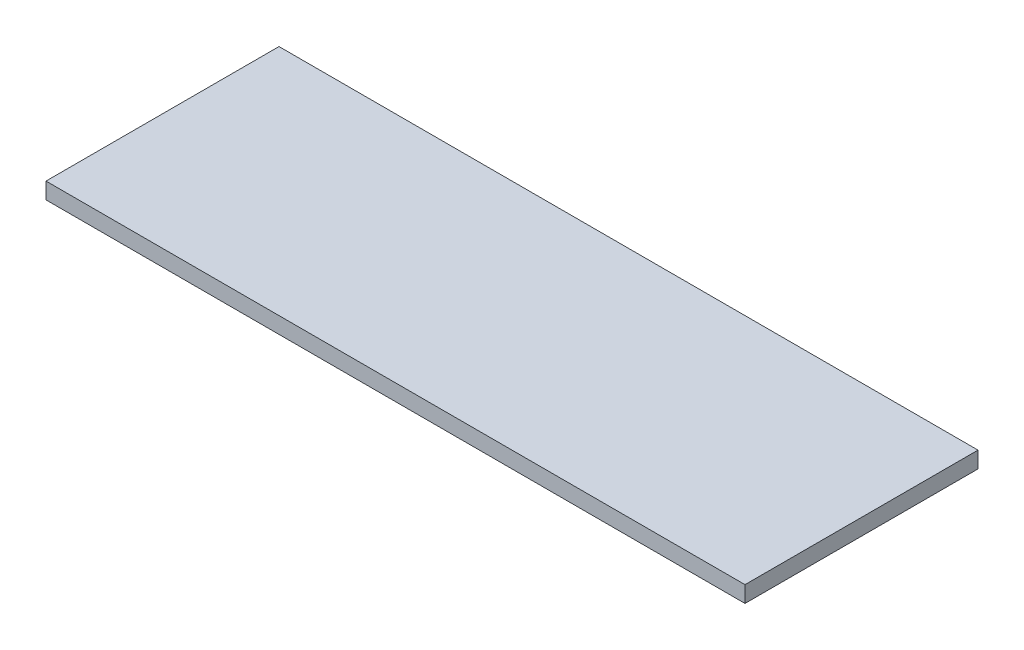
ISO-10303-21;
HEADER;
FILE_DESCRIPTION(('STEP AP214'),'2;1');
FILE_NAME('part.step','',(''),(''),'','','');
FILE_SCHEMA(('AUTOMOTIVE_DESIGN { 1 0 10303 214 1 1 1 1 }'));
ENDSEC;
DATA;
#1=APPLICATION_CONTEXT('core data for automotive mechanical design processes');
#2=APPLICATION_PROTOCOL_DEFINITION('international standard','automotive_design',2000,#1);
#3=PRODUCT_CONTEXT('',#1,'mechanical');
#4=PRODUCT('Part','Part','',(#3));
#5=PRODUCT_RELATED_PRODUCT_CATEGORY('part','',(#4));
#6=PRODUCT_DEFINITION_FORMATION('','',#4);
#7=PRODUCT_DEFINITION_CONTEXT('part definition',#1,'design');
#8=PRODUCT_DEFINITION('design','',#6,#7);
#9=PRODUCT_DEFINITION_SHAPE('','',#8);
#10=(LENGTH_UNIT() NAMED_UNIT(*) SI_UNIT(.MILLI.,.METRE.));
#11=(NAMED_UNIT(*) PLANE_ANGLE_UNIT() SI_UNIT($,.RADIAN.));
#12=(NAMED_UNIT(*) SI_UNIT($,.STERADIAN.) SOLID_ANGLE_UNIT());
#13=UNCERTAINTY_MEASURE_WITH_UNIT(LENGTH_MEASURE(1.E-05),#10,'distance_accuracy_value','');
#14=(GEOMETRIC_REPRESENTATION_CONTEXT(3) GLOBAL_UNCERTAINTY_ASSIGNED_CONTEXT((#13)) GLOBAL_UNIT_ASSIGNED_CONTEXT((#10,
#11,#12)) REPRESENTATION_CONTEXT('',''));
#15=CARTESIAN_POINT('',(0.,0.,0.));
#16=DIRECTION('',(0.,0.,1.));
#17=DIRECTION('',(1.,0.,0.));
#18=AXIS2_PLACEMENT_3D('',#15,#16,#17);
#19=CARTESIAN_POINT('',(15.,0.7,5.));
#20=DIRECTION('',(-1.,0.,0.));
#21=DIRECTION('',(0.,0.,1.));
#22=AXIS2_PLACEMENT_3D('',#19,#20,#21);
#23=PLANE('',#22);
#24=DIRECTION('',(0.,0.,-1.));
#25=VECTOR('',#24,1.);
#26=CARTESIAN_POINT('',(15.,0.,5.));
#27=LINE('',#26,#25);
#28=CARTESIAN_POINT('',(15.,0.,5.));
#29=VERTEX_POINT('',#28);
#30=CARTESIAN_POINT('',(15.,0.,-5.));
#31=VERTEX_POINT('',#30);
#32=EDGE_CURVE('E96',#29,#31,#27,.T.);
#33=ORIENTED_EDGE('',*,*,#32,.T.);
#34=DIRECTION('',(0.,-1.,0.));
#35=VECTOR('',#34,1.);
#36=CARTESIAN_POINT('',(15.,0.7,-5.));
#37=LINE('',#36,#35);
#38=CARTESIAN_POINT('',(15.,0.7,-5.));
#39=VERTEX_POINT('',#38);
#40=EDGE_CURVE('E11',#39,#31,#37,.T.);
#41=ORIENTED_EDGE('',*,*,#40,.F.);
#42=DIRECTION('',(0.,0.,-1.));
#43=VECTOR('',#42,1.);
#44=CARTESIAN_POINT('',(15.,0.7,5.));
#45=LINE('',#44,#43);
#46=CARTESIAN_POINT('',(15.,0.7,5.));
#47=VERTEX_POINT('',#46);
#48=EDGE_CURVE('E84',#47,#39,#45,.T.);
#49=ORIENTED_EDGE('',*,*,#48,.F.);
#50=DIRECTION('',(0.,-1.,0.));
#51=VECTOR('',#50,1.);
#52=CARTESIAN_POINT('',(15.,0.7,5.));
#53=LINE('',#52,#51);
#54=EDGE_CURVE('E92',#47,#29,#53,.T.);
#55=ORIENTED_EDGE('',*,*,#54,.T.);
#56=EDGE_LOOP('',(#33,#41,#49,#55));
#57=FACE_BOUND('',#56,.T.);
#58=ADVANCED_FACE('F33',(#57),#23,.F.);
#59=CARTESIAN_POINT('',(-15.,0.7,-5.));
#60=DIRECTION('',(0.,0.,1.));
#61=DIRECTION('',(1.,0.,0.));
#62=AXIS2_PLACEMENT_3D('',#59,#60,#61);
#63=PLANE('',#62);
#64=DIRECTION('',(-1.,0.,0.));
#65=VECTOR('',#64,1.);
#66=CARTESIAN_POINT('',(-15.,0.,-5.));
#67=LINE('',#66,#65);
#68=CARTESIAN_POINT('',(-15.,0.,-5.));
#69=VERTEX_POINT('',#68);
#70=EDGE_CURVE('E88',#31,#69,#67,.T.);
#71=ORIENTED_EDGE('',*,*,#70,.T.);
#72=DIRECTION('',(0.,-1.,0.));
#73=VECTOR('',#72,1.);
#74=CARTESIAN_POINT('',(-15.,0.7,-5.));
#75=LINE('',#74,#73);
#76=CARTESIAN_POINT('',(-15.,0.7,-5.));
#77=VERTEX_POINT('',#76);
#78=EDGE_CURVE('E41',#77,#69,#75,.T.);
#79=ORIENTED_EDGE('',*,*,#78,.F.);
#80=DIRECTION('',(-1.,0.,0.));
#81=VECTOR('',#80,1.);
#82=CARTESIAN_POINT('',(-15.,0.7,-5.));
#83=LINE('',#82,#81);
#84=EDGE_CURVE('E79',#39,#77,#83,.T.);
#85=ORIENTED_EDGE('',*,*,#84,.F.);
#86=ORIENTED_EDGE('',*,*,#40,.T.);
#87=EDGE_LOOP('',(#71,#79,#85,#86));
#88=FACE_BOUND('',#87,.T.);
#89=ADVANCED_FACE('F87',(#88),#63,.F.);
#90=CARTESIAN_POINT('',(-15.,0.7,5.));
#91=DIRECTION('',(1.,0.,0.));
#92=DIRECTION('',(0.,0.,-1.));
#93=AXIS2_PLACEMENT_3D('',#90,#91,#92);
#94=PLANE('',#93);
#95=DIRECTION('',(0.,0.,1.));
#96=VECTOR('',#95,1.);
#97=CARTESIAN_POINT('',(-15.,0.,5.));
#98=LINE('',#97,#96);
#99=CARTESIAN_POINT('',(-15.,0.,5.));
#100=VERTEX_POINT('',#99);
#101=EDGE_CURVE('E66',#69,#100,#98,.T.);
#102=ORIENTED_EDGE('',*,*,#101,.T.);
#103=DIRECTION('',(0.,-1.,0.));
#104=VECTOR('',#103,1.);
#105=CARTESIAN_POINT('',(-15.,0.7,5.));
#106=LINE('',#105,#104);
#107=CARTESIAN_POINT('',(-15.,0.7,5.));
#108=VERTEX_POINT('',#107);
#109=EDGE_CURVE('E89',#108,#100,#106,.T.);
#110=ORIENTED_EDGE('',*,*,#109,.F.);
#111=DIRECTION('',(0.,0.,1.));
#112=VECTOR('',#111,1.);
#113=CARTESIAN_POINT('',(-15.,0.7,5.));
#114=LINE('',#113,#112);
#115=EDGE_CURVE('E82',#77,#108,#114,.T.);
#116=ORIENTED_EDGE('',*,*,#115,.F.);
#117=ORIENTED_EDGE('',*,*,#78,.T.);
#118=EDGE_LOOP('',(#102,#110,#116,#117));
#119=FACE_BOUND('',#118,.T.);
#120=ADVANCED_FACE('F90',(#119),#94,.F.);
#121=CARTESIAN_POINT('',(-15.,0.7,5.));
#122=DIRECTION('',(0.,0.,-1.));
#123=DIRECTION('',(-1.,0.,0.));
#124=AXIS2_PLACEMENT_3D('',#121,#122,#123);
#125=PLANE('',#124);
#126=DIRECTION('',(1.,0.,0.));
#127=VECTOR('',#126,1.);
#128=CARTESIAN_POINT('',(-15.,0.,5.));
#129=LINE('',#128,#127);
#130=EDGE_CURVE('E72',#100,#29,#129,.T.);
#131=ORIENTED_EDGE('',*,*,#130,.T.);
#132=ORIENTED_EDGE('',*,*,#54,.F.);
#133=DIRECTION('',(1.,0.,0.));
#134=VECTOR('',#133,1.);
#135=CARTESIAN_POINT('',(-15.,0.7,5.));
#136=LINE('',#135,#134);
#137=EDGE_CURVE('E49',#108,#47,#136,.T.);
#138=ORIENTED_EDGE('',*,*,#137,.F.);
#139=ORIENTED_EDGE('',*,*,#109,.T.);
#140=EDGE_LOOP('',(#131,#132,#138,#139));
#141=FACE_BOUND('',#140,.T.);
#142=ADVANCED_FACE('F103',(#141),#125,.F.);
#143=CARTESIAN_POINT('',(0.,0.7,0.));
#144=DIRECTION('',(0.,-1.,0.));
#145=DIRECTION('',(0.,0.,-1.));
#146=AXIS2_PLACEMENT_3D('',#143,#144,#145);
#147=PLANE('',#146);
#148=ORIENTED_EDGE('',*,*,#48,.T.);
#149=ORIENTED_EDGE('',*,*,#84,.T.);
#150=ORIENTED_EDGE('',*,*,#115,.T.);
#151=ORIENTED_EDGE('',*,*,#137,.T.);
#152=EDGE_LOOP('',(#148,#149,#150,#151));
#153=FACE_BOUND('',#152,.T.);
#154=ADVANCED_FACE('F80',(#153),#147,.F.);
#155=CARTESIAN_POINT('',(0.,0.,0.));
#156=DIRECTION('',(0.,-1.,0.));
#157=DIRECTION('',(0.,0.,-1.));
#158=AXIS2_PLACEMENT_3D('',#155,#156,#157);
#159=PLANE('',#158);
#160=ORIENTED_EDGE('',*,*,#32,.F.);
#161=ORIENTED_EDGE('',*,*,#130,.F.);
#162=ORIENTED_EDGE('',*,*,#101,.F.);
#163=ORIENTED_EDGE('',*,*,#70,.F.);
#164=EDGE_LOOP('',(#160,#161,#162,#163));
#165=FACE_BOUND('',#164,.T.);
#166=ADVANCED_FACE('F106',(#165),#159,.T.);
#167=CLOSED_SHELL('',(#58,#89,#120,#142,#154,#166));
#168=MANIFOLD_SOLID_BREP('B2',#167);
#169=ADVANCED_BREP_SHAPE_REPRESENTATION('',(#18,#168),#14);
#170=SHAPE_DEFINITION_REPRESENTATION(#9,#169);
ENDSEC;
END-ISO-10303-21;
